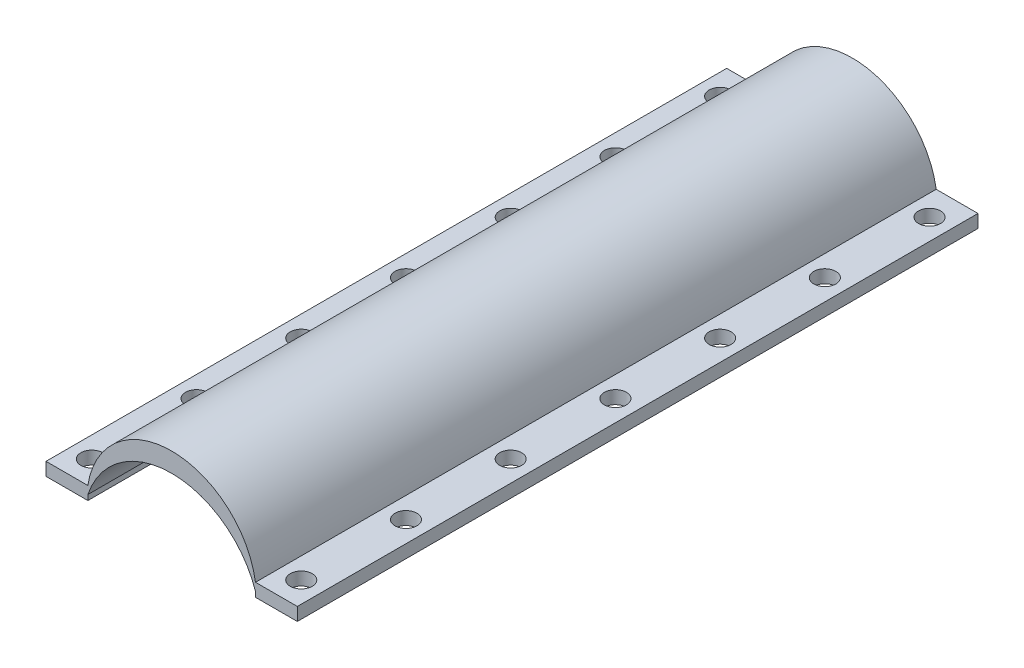
ISO-10303-21;
HEADER;
FILE_DESCRIPTION(('STEP AP214'),'2;1');
FILE_NAME('part.step','',(''),(''),'','','');
FILE_SCHEMA(('AUTOMOTIVE_DESIGN { 1 0 10303 214 1 1 1 1 }'));
ENDSEC;
DATA;
#1=APPLICATION_CONTEXT('core data for automotive mechanical design processes');
#2=APPLICATION_PROTOCOL_DEFINITION('international standard','automotive_design',2000,#1);
#3=PRODUCT_CONTEXT('',#1,'mechanical');
#4=PRODUCT('Part','Part','',(#3));
#5=PRODUCT_RELATED_PRODUCT_CATEGORY('part','',(#4));
#6=PRODUCT_DEFINITION_FORMATION('','',#4);
#7=PRODUCT_DEFINITION_CONTEXT('part definition',#1,'design');
#8=PRODUCT_DEFINITION('design','',#6,#7);
#9=PRODUCT_DEFINITION_SHAPE('','',#8);
#10=(LENGTH_UNIT() NAMED_UNIT(*) SI_UNIT(.MILLI.,.METRE.));
#11=(NAMED_UNIT(*) PLANE_ANGLE_UNIT() SI_UNIT($,.RADIAN.));
#12=(NAMED_UNIT(*) SI_UNIT($,.STERADIAN.) SOLID_ANGLE_UNIT());
#13=UNCERTAINTY_MEASURE_WITH_UNIT(LENGTH_MEASURE(1.E-05),#10,'distance_accuracy_value','');
#14=(GEOMETRIC_REPRESENTATION_CONTEXT(3) GLOBAL_UNCERTAINTY_ASSIGNED_CONTEXT((#13)) GLOBAL_UNIT_ASSIGNED_CONTEXT((#10,
#11,#12)) REPRESENTATION_CONTEXT('',''));
#15=CARTESIAN_POINT('',(0.,0.,0.));
#16=DIRECTION('',(0.,0.,1.));
#17=DIRECTION('',(1.,0.,0.));
#18=AXIS2_PLACEMENT_3D('',#15,#16,#17);
#19=CARTESIAN_POINT('',(25.4,0.,165.1));
#20=DIRECTION('',(0.,0.,-1.));
#21=DIRECTION('',(-1.,0.,0.));
#22=AXIS2_PLACEMENT_3D('',#19,#20,#21);
#23=CYLINDRICAL_SURFACE('',#22,20.580602670363);
#24=CARTESIAN_POINT('',(25.4,0.,0.));
#25=DIRECTION('',(0.,0.,1.));
#26=DIRECTION('',(-1.,0.,0.));
#27=AXIS2_PLACEMENT_3D('',#24,#25,#26);
#28=CIRCLE('',#27,20.580602670363);
#29=CARTESIAN_POINT('',(45.7363016753769,3.16165153731608,0.));
#30=VERTEX_POINT('',#29);
#31=CARTESIAN_POINT('',(5.06369832462309,3.16165153731608,0.));
#32=VERTEX_POINT('',#31);
#33=EDGE_CURVE('E160',#30,#32,#28,.T.);
#34=ORIENTED_EDGE('',*,*,#33,.T.);
#35=DIRECTION('',(0.,0.,-1.));
#36=VECTOR('',#35,1.);
#37=CARTESIAN_POINT('',(5.06369832462309,3.16165153731608,165.1));
#38=LINE('',#37,#36);
#39=CARTESIAN_POINT('',(5.06369832462309,3.16165153731608,165.1));
#40=VERTEX_POINT('',#39);
#41=EDGE_CURVE('E11',#40,#32,#38,.T.);
#42=ORIENTED_EDGE('',*,*,#41,.F.);
#43=CARTESIAN_POINT('',(25.4,0.,165.1));
#44=DIRECTION('',(0.,0.,1.));
#45=DIRECTION('',(-1.,0.,0.));
#46=AXIS2_PLACEMENT_3D('',#43,#44,#45);
#47=CIRCLE('',#46,20.580602670363);
#48=CARTESIAN_POINT('',(45.7363016753769,3.16165153731608,165.1));
#49=VERTEX_POINT('',#48);
#50=EDGE_CURVE('E188',#49,#40,#47,.T.);
#51=ORIENTED_EDGE('',*,*,#50,.F.);
#52=DIRECTION('',(0.,0.,-1.));
#53=VECTOR('',#52,1.);
#54=CARTESIAN_POINT('',(45.7363016753769,3.16165153731608,165.1));
#55=LINE('',#54,#53);
#56=EDGE_CURVE('E156',#49,#30,#55,.T.);
#57=ORIENTED_EDGE('',*,*,#56,.T.);
#58=EDGE_LOOP('',(#34,#42,#51,#57));
#59=FACE_BOUND('',#58,.T.);
#60=ADVANCED_FACE('F45',(#59),#23,.T.);
#61=CARTESIAN_POINT('',(-5.08,3.16165153731608,165.1));
#62=DIRECTION('',(0.,-1.,0.));
#63=DIRECTION('',(0.,0.,-1.));
#64=AXIS2_PLACEMENT_3D('',#61,#62,#63);
#65=PLANE('',#64);
#66=CARTESIAN_POINT('',(0.,3.16165153731608,32.0675));
#67=DIRECTION('',(0.,1.,0.));
#68=DIRECTION('',(0.,0.,1.));
#69=AXIS2_PLACEMENT_3D('',#66,#67,#68);
#70=CIRCLE('',#69,2.667);
#71=CARTESIAN_POINT('',(0.,3.16165153731608,34.7345));
#72=VERTEX_POINT('',#71);
#73=EDGE_CURVE('E390',#72,#72,#70,.T.);
#74=ORIENTED_EDGE('',*,*,#73,.F.);
#75=EDGE_LOOP('',(#74));
#76=FACE_BOUND('',#75,.T.);
#77=CARTESIAN_POINT('',(0.,3.16165153731608,57.4675));
#78=DIRECTION('',(0.,1.,0.));
#79=DIRECTION('',(0.,0.,1.));
#80=AXIS2_PLACEMENT_3D('',#77,#78,#79);
#81=CIRCLE('',#80,2.667);
#82=CARTESIAN_POINT('',(0.,3.16165153731608,60.1345));
#83=VERTEX_POINT('',#82);
#84=EDGE_CURVE('E384',#83,#83,#81,.T.);
#85=ORIENTED_EDGE('',*,*,#84,.F.);
#86=EDGE_LOOP('',(#85));
#87=FACE_BOUND('',#86,.T.);
#88=CARTESIAN_POINT('',(0.,3.16165153731608,82.8675));
#89=DIRECTION('',(0.,1.,0.));
#90=DIRECTION('',(0.,0.,1.));
#91=AXIS2_PLACEMENT_3D('',#88,#89,#90);
#92=CIRCLE('',#91,2.667);
#93=CARTESIAN_POINT('',(0.,3.16165153731608,85.5345));
#94=VERTEX_POINT('',#93);
#95=EDGE_CURVE('E367',#94,#94,#92,.T.);
#96=ORIENTED_EDGE('',*,*,#95,.F.);
#97=EDGE_LOOP('',(#96));
#98=FACE_BOUND('',#97,.T.);
#99=CARTESIAN_POINT('',(0.,3.16165153731608,108.2675));
#100=DIRECTION('',(0.,1.,0.));
#101=DIRECTION('',(0.,0.,1.));
#102=AXIS2_PLACEMENT_3D('',#99,#100,#101);
#103=CIRCLE('',#102,2.667);
#104=CARTESIAN_POINT('',(0.,3.16165153731608,110.9345));
#105=VERTEX_POINT('',#104);
#106=EDGE_CURVE('E385',#105,#105,#103,.T.);
#107=ORIENTED_EDGE('',*,*,#106,.F.);
#108=EDGE_LOOP('',(#107));
#109=FACE_BOUND('',#108,.T.);
#110=CARTESIAN_POINT('',(0.,3.16165153731608,133.6675));
#111=DIRECTION('',(0.,1.,0.));
#112=DIRECTION('',(0.,0.,1.));
#113=AXIS2_PLACEMENT_3D('',#110,#111,#112);
#114=CIRCLE('',#113,2.667);
#115=CARTESIAN_POINT('',(0.,3.16165153731608,136.3345));
#116=VERTEX_POINT('',#115);
#117=EDGE_CURVE('E393',#116,#116,#114,.T.);
#118=ORIENTED_EDGE('',*,*,#117,.F.);
#119=EDGE_LOOP('',(#118));
#120=FACE_BOUND('',#119,.T.);
#121=CARTESIAN_POINT('',(0.,3.16165153731608,159.0675));
#122=DIRECTION('',(0.,1.,0.));
#123=DIRECTION('',(0.,0.,1.));
#124=AXIS2_PLACEMENT_3D('',#121,#122,#123);
#125=CIRCLE('',#124,2.667);
#126=CARTESIAN_POINT('',(0.,3.16165153731608,161.7345));
#127=VERTEX_POINT('',#126);
#128=EDGE_CURVE('E400',#127,#127,#125,.T.);
#129=ORIENTED_EDGE('',*,*,#128,.F.);
#130=EDGE_LOOP('',(#129));
#131=FACE_BOUND('',#130,.T.);
#132=CARTESIAN_POINT('',(0.,3.16165153731608,6.6675));
#133=DIRECTION('',(0.,1.,0.));
#134=DIRECTION('',(0.,0.,1.));
#135=AXIS2_PLACEMENT_3D('',#132,#133,#134);
#136=CIRCLE('',#135,2.667);
#137=CARTESIAN_POINT('',(0.,3.16165153731608,9.3345));
#138=VERTEX_POINT('',#137);
#139=EDGE_CURVE('E413',#138,#138,#136,.T.);
#140=ORIENTED_EDGE('',*,*,#139,.F.);
#141=EDGE_LOOP('',(#140));
#142=FACE_BOUND('',#141,.T.);
#143=DIRECTION('',(-1.,0.,0.));
#144=VECTOR('',#143,1.);
#145=CARTESIAN_POINT('',(-5.08,3.16165153731608,0.));
#146=LINE('',#145,#144);
#147=CARTESIAN_POINT('',(-5.08,3.16165153731608,0.));
#148=VERTEX_POINT('',#147);
#149=EDGE_CURVE('E164',#32,#148,#146,.T.);
#150=ORIENTED_EDGE('',*,*,#149,.T.);
#151=DIRECTION('',(0.,0.,-1.));
#152=VECTOR('',#151,1.);
#153=CARTESIAN_POINT('',(-5.08,3.16165153731608,165.1));
#154=LINE('',#153,#152);
#155=CARTESIAN_POINT('',(-5.08,3.16165153731608,165.1));
#156=VERTEX_POINT('',#155);
#157=EDGE_CURVE('E55',#156,#148,#154,.T.);
#158=ORIENTED_EDGE('',*,*,#157,.F.);
#159=DIRECTION('',(-1.,0.,0.));
#160=VECTOR('',#159,1.);
#161=CARTESIAN_POINT('',(-5.08,3.16165153731608,165.1));
#162=LINE('',#161,#160);
#163=EDGE_CURVE('E113',#40,#156,#162,.T.);
#164=ORIENTED_EDGE('',*,*,#163,.F.);
#165=ORIENTED_EDGE('',*,*,#41,.T.);
#166=EDGE_LOOP('',(#150,#158,#164,#165));
#167=FACE_BOUND('',#166,.T.);
#168=ADVANCED_FACE('F259',(#76,#87,#98,#109,#120,#131,#142,#167),#65,.F.);
#169=CARTESIAN_POINT('',(-5.08,0.,165.1));
#170=DIRECTION('',(1.,0.,0.));
#171=DIRECTION('',(0.,0.,-1.));
#172=AXIS2_PLACEMENT_3D('',#169,#170,#171);
#173=PLANE('',#172);
#174=DIRECTION('',(0.,-1.,0.));
#175=VECTOR('',#174,1.);
#176=CARTESIAN_POINT('',(-5.08,0.,0.));
#177=LINE('',#176,#175);
#178=CARTESIAN_POINT('',(-5.08,0.,0.));
#179=VERTEX_POINT('',#178);
#180=EDGE_CURVE('E167',#148,#179,#177,.T.);
#181=ORIENTED_EDGE('',*,*,#180,.T.);
#182=DIRECTION('',(0.,0.,-1.));
#183=VECTOR('',#182,1.);
#184=CARTESIAN_POINT('',(-5.08,0.,165.1));
#185=LINE('',#184,#183);
#186=CARTESIAN_POINT('',(-5.08,0.,165.1));
#187=VERTEX_POINT('',#186);
#188=EDGE_CURVE('E207',#187,#179,#185,.T.);
#189=ORIENTED_EDGE('',*,*,#188,.F.);
#190=DIRECTION('',(0.,-1.,0.));
#191=VECTOR('',#190,1.);
#192=CARTESIAN_POINT('',(-5.08,0.,165.1));
#193=LINE('',#192,#191);
#194=EDGE_CURVE('E277',#156,#187,#193,.T.);
#195=ORIENTED_EDGE('',*,*,#194,.F.);
#196=ORIENTED_EDGE('',*,*,#157,.T.);
#197=EDGE_LOOP('',(#181,#189,#195,#196));
#198=FACE_BOUND('',#197,.T.);
#199=ADVANCED_FACE('F265',(#198),#173,.F.);
#200=CARTESIAN_POINT('',(-5.08,0.,165.1));
#201=DIRECTION('',(0.,1.,0.));
#202=DIRECTION('',(-1.,0.,0.));
#203=AXIS2_PLACEMENT_3D('',#200,#201,#202);
#204=PLANE('',#203);
#205=CARTESIAN_POINT('',(0.,0.,32.0675));
#206=DIRECTION('',(0.,1.,0.));
#207=DIRECTION('',(-1.,0.,0.));
#208=AXIS2_PLACEMENT_3D('',#205,#206,#207);
#209=CIRCLE('',#208,2.667);
#210=CARTESIAN_POINT('',(-2.667,0.,32.0675));
#211=VERTEX_POINT('',#210);
#212=EDGE_CURVE('E48',#211,#211,#209,.T.);
#213=ORIENTED_EDGE('',*,*,#212,.T.);
#214=EDGE_LOOP('',(#213));
#215=FACE_BOUND('',#214,.T.);
#216=CARTESIAN_POINT('',(0.,0.,57.4675));
#217=DIRECTION('',(0.,1.,0.));
#218=DIRECTION('',(-1.,0.,0.));
#219=AXIS2_PLACEMENT_3D('',#216,#217,#218);
#220=CIRCLE('',#219,2.667);
#221=CARTESIAN_POINT('',(-2.667,0.,57.4675));
#222=VERTEX_POINT('',#221);
#223=EDGE_CURVE('E234',#222,#222,#220,.T.);
#224=ORIENTED_EDGE('',*,*,#223,.T.);
#225=EDGE_LOOP('',(#224));
#226=FACE_BOUND('',#225,.T.);
#227=CARTESIAN_POINT('',(0.,0.,82.8675));
#228=DIRECTION('',(0.,1.,0.));
#229=DIRECTION('',(-1.,0.,0.));
#230=AXIS2_PLACEMENT_3D('',#227,#228,#229);
#231=CIRCLE('',#230,2.667);
#232=CARTESIAN_POINT('',(-2.66699999999999,0.,82.8675));
#233=VERTEX_POINT('',#232);
#234=EDGE_CURVE('E231',#233,#233,#231,.T.);
#235=ORIENTED_EDGE('',*,*,#234,.T.);
#236=EDGE_LOOP('',(#235));
#237=FACE_BOUND('',#236,.T.);
#238=CARTESIAN_POINT('',(0.,0.,108.2675));
#239=DIRECTION('',(0.,1.,0.));
#240=DIRECTION('',(-1.,0.,0.));
#241=AXIS2_PLACEMENT_3D('',#238,#239,#240);
#242=CIRCLE('',#241,2.667);
#243=CARTESIAN_POINT('',(-2.66699999999999,0.,108.2675));
#244=VERTEX_POINT('',#243);
#245=EDGE_CURVE('E227',#244,#244,#242,.T.);
#246=ORIENTED_EDGE('',*,*,#245,.T.);
#247=EDGE_LOOP('',(#246));
#248=FACE_BOUND('',#247,.T.);
#249=CARTESIAN_POINT('',(0.,0.,133.6675));
#250=DIRECTION('',(0.,1.,0.));
#251=DIRECTION('',(-1.,0.,0.));
#252=AXIS2_PLACEMENT_3D('',#249,#250,#251);
#253=CIRCLE('',#252,2.667);
#254=CARTESIAN_POINT('',(-2.667,0.,133.6675));
#255=VERTEX_POINT('',#254);
#256=EDGE_CURVE('E223',#255,#255,#253,.T.);
#257=ORIENTED_EDGE('',*,*,#256,.T.);
#258=EDGE_LOOP('',(#257));
#259=FACE_BOUND('',#258,.T.);
#260=CARTESIAN_POINT('',(0.,0.,159.0675));
#261=DIRECTION('',(0.,1.,0.));
#262=DIRECTION('',(-1.,0.,0.));
#263=AXIS2_PLACEMENT_3D('',#260,#261,#262);
#264=CIRCLE('',#263,2.667);
#265=CARTESIAN_POINT('',(-2.667,0.,159.0675));
#266=VERTEX_POINT('',#265);
#267=EDGE_CURVE('E218',#266,#266,#264,.T.);
#268=ORIENTED_EDGE('',*,*,#267,.T.);
#269=EDGE_LOOP('',(#268));
#270=FACE_BOUND('',#269,.T.);
#271=CARTESIAN_POINT('',(0.,0.,6.6675));
#272=DIRECTION('',(0.,1.,0.));
#273=DIRECTION('',(-1.,0.,0.));
#274=AXIS2_PLACEMENT_3D('',#271,#272,#273);
#275=CIRCLE('',#274,2.667);
#276=CARTESIAN_POINT('',(-2.667,0.,6.6675));
#277=VERTEX_POINT('',#276);
#278=EDGE_CURVE('E214',#277,#277,#275,.T.);
#279=ORIENTED_EDGE('',*,*,#278,.T.);
#280=EDGE_LOOP('',(#279));
#281=FACE_BOUND('',#280,.T.);
#282=DIRECTION('',(1.,0.,0.));
#283=VECTOR('',#282,1.);
#284=CARTESIAN_POINT('',(-5.08,0.,0.));
#285=LINE('',#284,#283);
#286=CARTESIAN_POINT('',(5.08,0.,0.));
#287=VERTEX_POINT('',#286);
#288=EDGE_CURVE('E170',#179,#287,#285,.T.);
#289=ORIENTED_EDGE('',*,*,#288,.T.);
#290=DIRECTION('',(0.,0.,-1.));
#291=VECTOR('',#290,1.);
#292=CARTESIAN_POINT('',(5.08,0.,165.1));
#293=LINE('',#292,#291);
#294=CARTESIAN_POINT('',(5.08,0.,165.1));
#295=VERTEX_POINT('',#294);
#296=EDGE_CURVE('E203',#295,#287,#293,.T.);
#297=ORIENTED_EDGE('',*,*,#296,.F.);
#298=DIRECTION('',(1.,0.,0.));
#299=VECTOR('',#298,1.);
#300=CARTESIAN_POINT('',(-5.08,0.,165.1));
#301=LINE('',#300,#299);
#302=EDGE_CURVE('E280',#187,#295,#301,.T.);
#303=ORIENTED_EDGE('',*,*,#302,.F.);
#304=ORIENTED_EDGE('',*,*,#188,.T.);
#305=EDGE_LOOP('',(#289,#297,#303,#304));
#306=FACE_BOUND('',#305,.T.);
#307=ADVANCED_FACE('F243',(#215,#226,#237,#248,#259,#270,#281,#306),#204,.F.);
#308=CARTESIAN_POINT('',(5.08,0.,165.1));
#309=DIRECTION('',(-1.,0.,0.));
#310=DIRECTION('',(0.,0.,1.));
#311=AXIS2_PLACEMENT_3D('',#308,#309,#310);
#312=PLANE('',#311);
#313=DIRECTION('',(0.,1.,0.));
#314=VECTOR('',#313,1.);
#315=CARTESIAN_POINT('',(5.08,0.,0.));
#316=LINE('',#315,#314);
#317=CARTESIAN_POINT('',(5.08,1.27,0.));
#318=VERTEX_POINT('',#317);
#319=EDGE_CURVE('E173',#287,#318,#316,.T.);
#320=ORIENTED_EDGE('',*,*,#319,.T.);
#321=DIRECTION('',(0.,0.,-1.));
#322=VECTOR('',#321,1.);
#323=CARTESIAN_POINT('',(5.08,1.27,165.1));
#324=LINE('',#323,#322);
#325=CARTESIAN_POINT('',(5.08,1.27,165.1));
#326=VERTEX_POINT('',#325);
#327=EDGE_CURVE('E199',#326,#318,#324,.T.);
#328=ORIENTED_EDGE('',*,*,#327,.F.);
#329=DIRECTION('',(0.,1.,0.));
#330=VECTOR('',#329,1.);
#331=CARTESIAN_POINT('',(5.08,0.,165.1));
#332=LINE('',#331,#330);
#333=EDGE_CURVE('E284',#295,#326,#332,.T.);
#334=ORIENTED_EDGE('',*,*,#333,.F.);
#335=ORIENTED_EDGE('',*,*,#296,.T.);
#336=EDGE_LOOP('',(#320,#328,#334,#335));
#337=FACE_BOUND('',#336,.T.);
#338=ADVANCED_FACE('F306',(#337),#312,.F.);
#339=CARTESIAN_POINT('',(25.4,-5.5331580411657,165.1));
#340=DIRECTION('',(0.,0.,-1.));
#341=DIRECTION('',(-1.,0.,0.));
#342=AXIS2_PLACEMENT_3D('',#339,#340,#341);
#343=CYLINDRICAL_SURFACE('',#342,21.4286107653548);
#344=CARTESIAN_POINT('',(25.4,-5.5331580411657,0.));
#345=DIRECTION('',(0.,0.,-1.));
#346=DIRECTION('',(-1.,0.,0.));
#347=AXIS2_PLACEMENT_3D('',#344,#345,#346);
#348=CIRCLE('',#347,21.4286107653548);
#349=CARTESIAN_POINT('',(45.72,1.27,0.));
#350=VERTEX_POINT('',#349);
#351=EDGE_CURVE('E176',#318,#350,#348,.T.);
#352=ORIENTED_EDGE('',*,*,#351,.T.);
#353=DIRECTION('',(0.,0.,-1.));
#354=VECTOR('',#353,1.);
#355=CARTESIAN_POINT('',(45.72,1.27,165.1));
#356=LINE('',#355,#354);
#357=CARTESIAN_POINT('',(45.72,1.27,165.1));
#358=VERTEX_POINT('',#357);
#359=EDGE_CURVE('E195',#358,#350,#356,.T.);
#360=ORIENTED_EDGE('',*,*,#359,.F.);
#361=CARTESIAN_POINT('',(25.4,-5.5331580411657,165.1));
#362=DIRECTION('',(0.,0.,-1.));
#363=DIRECTION('',(-1.,0.,0.));
#364=AXIS2_PLACEMENT_3D('',#361,#362,#363);
#365=CIRCLE('',#364,21.4286107653548);
#366=EDGE_CURVE('E291',#326,#358,#365,.T.);
#367=ORIENTED_EDGE('',*,*,#366,.F.);
#368=ORIENTED_EDGE('',*,*,#327,.T.);
#369=EDGE_LOOP('',(#352,#360,#367,#368));
#370=FACE_BOUND('',#369,.T.);
#371=ADVANCED_FACE('F299',(#370),#343,.F.);
#372=CARTESIAN_POINT('',(45.72,0.,165.1));
#373=DIRECTION('',(1.,0.,0.));
#374=DIRECTION('',(0.,0.,-1.));
#375=AXIS2_PLACEMENT_3D('',#372,#373,#374);
#376=PLANE('',#375);
#377=DIRECTION('',(0.,-1.,0.));
#378=VECTOR('',#377,1.);
#379=CARTESIAN_POINT('',(45.72,0.,0.));
#380=LINE('',#379,#378);
#381=CARTESIAN_POINT('',(45.72,0.,0.));
#382=VERTEX_POINT('',#381);
#383=EDGE_CURVE('E179',#350,#382,#380,.T.);
#384=ORIENTED_EDGE('',*,*,#383,.T.);
#385=DIRECTION('',(0.,0.,-1.));
#386=VECTOR('',#385,1.);
#387=CARTESIAN_POINT('',(45.72,0.,165.1));
#388=LINE('',#387,#386);
#389=CARTESIAN_POINT('',(45.72,0.,165.1));
#390=VERTEX_POINT('',#389);
#391=EDGE_CURVE('E149',#390,#382,#388,.T.);
#392=ORIENTED_EDGE('',*,*,#391,.F.);
#393=DIRECTION('',(0.,-1.,0.));
#394=VECTOR('',#393,1.);
#395=CARTESIAN_POINT('',(45.72,0.,165.1));
#396=LINE('',#395,#394);
#397=EDGE_CURVE('E138',#358,#390,#396,.T.);
#398=ORIENTED_EDGE('',*,*,#397,.F.);
#399=ORIENTED_EDGE('',*,*,#359,.T.);
#400=EDGE_LOOP('',(#384,#392,#398,#399));
#401=FACE_BOUND('',#400,.T.);
#402=ADVANCED_FACE('F303',(#401),#376,.F.);
#403=CARTESIAN_POINT('',(45.72,0.,165.1));
#404=DIRECTION('',(0.,1.,0.));
#405=DIRECTION('',(-1.,0.,0.));
#406=AXIS2_PLACEMENT_3D('',#403,#404,#405);
#407=PLANE('',#406);
#408=CARTESIAN_POINT('',(50.8,0.,159.0675));
#409=DIRECTION('',(0.,1.,0.));
#410=DIRECTION('',(-1.,0.,0.));
#411=AXIS2_PLACEMENT_3D('',#408,#409,#410);
#412=CIRCLE('',#411,2.667);
#413=CARTESIAN_POINT('',(48.133,0.,159.0675));
#414=VERTEX_POINT('',#413);
#415=EDGE_CURVE('E219',#414,#414,#412,.T.);
#416=ORIENTED_EDGE('',*,*,#415,.T.);
#417=EDGE_LOOP('',(#416));
#418=FACE_BOUND('',#417,.T.);
#419=CARTESIAN_POINT('',(50.8,0.,133.6675));
#420=DIRECTION('',(0.,1.,0.));
#421=DIRECTION('',(-1.,0.,0.));
#422=AXIS2_PLACEMENT_3D('',#419,#420,#421);
#423=CIRCLE('',#422,2.667);
#424=CARTESIAN_POINT('',(48.133,0.,133.6675));
#425=VERTEX_POINT('',#424);
#426=EDGE_CURVE('E437',#425,#425,#423,.T.);
#427=ORIENTED_EDGE('',*,*,#426,.T.);
#428=EDGE_LOOP('',(#427));
#429=FACE_BOUND('',#428,.T.);
#430=CARTESIAN_POINT('',(50.8,0.,108.2675));
#431=DIRECTION('',(0.,1.,0.));
#432=DIRECTION('',(-1.,0.,0.));
#433=AXIS2_PLACEMENT_3D('',#430,#431,#432);
#434=CIRCLE('',#433,2.66699999999999);
#435=CARTESIAN_POINT('',(48.133,0.,108.2675));
#436=VERTEX_POINT('',#435);
#437=EDGE_CURVE('E433',#436,#436,#434,.T.);
#438=ORIENTED_EDGE('',*,*,#437,.T.);
#439=EDGE_LOOP('',(#438));
#440=FACE_BOUND('',#439,.T.);
#441=CARTESIAN_POINT('',(50.8,0.,82.8675));
#442=DIRECTION('',(0.,1.,0.));
#443=DIRECTION('',(-1.,0.,0.));
#444=AXIS2_PLACEMENT_3D('',#441,#442,#443);
#445=CIRCLE('',#444,2.66699999999999);
#446=CARTESIAN_POINT('',(48.133,0.,82.8675));
#447=VERTEX_POINT('',#446);
#448=EDGE_CURVE('E429',#447,#447,#445,.T.);
#449=ORIENTED_EDGE('',*,*,#448,.T.);
#450=EDGE_LOOP('',(#449));
#451=FACE_BOUND('',#450,.T.);
#452=CARTESIAN_POINT('',(50.8,0.,57.4675));
#453=DIRECTION('',(0.,1.,0.));
#454=DIRECTION('',(-1.,0.,0.));
#455=AXIS2_PLACEMENT_3D('',#452,#453,#454);
#456=CIRCLE('',#455,2.667);
#457=CARTESIAN_POINT('',(48.133,0.,57.4675));
#458=VERTEX_POINT('',#457);
#459=EDGE_CURVE('E425',#458,#458,#456,.T.);
#460=ORIENTED_EDGE('',*,*,#459,.T.);
#461=EDGE_LOOP('',(#460));
#462=FACE_BOUND('',#461,.T.);
#463=CARTESIAN_POINT('',(50.8,0.,32.0675));
#464=DIRECTION('',(0.,1.,0.));
#465=DIRECTION('',(-1.,0.,0.));
#466=AXIS2_PLACEMENT_3D('',#463,#464,#465);
#467=CIRCLE('',#466,2.667);
#468=CARTESIAN_POINT('',(48.133,0.,32.0675));
#469=VERTEX_POINT('',#468);
#470=EDGE_CURVE('E421',#469,#469,#467,.T.);
#471=ORIENTED_EDGE('',*,*,#470,.T.);
#472=EDGE_LOOP('',(#471));
#473=FACE_BOUND('',#472,.T.);
#474=CARTESIAN_POINT('',(50.8,0.,6.66749999999999));
#475=DIRECTION('',(0.,1.,0.));
#476=DIRECTION('',(-1.,0.,0.));
#477=AXIS2_PLACEMENT_3D('',#474,#475,#476);
#478=CIRCLE('',#477,2.667);
#479=CARTESIAN_POINT('',(48.133,0.,6.66749999999999));
#480=VERTEX_POINT('',#479);
#481=EDGE_CURVE('E417',#480,#480,#478,.T.);
#482=ORIENTED_EDGE('',*,*,#481,.T.);
#483=EDGE_LOOP('',(#482));
#484=FACE_BOUND('',#483,.T.);
#485=DIRECTION('',(1.,0.,0.));
#486=VECTOR('',#485,1.);
#487=CARTESIAN_POINT('',(45.72,0.,0.));
#488=LINE('',#487,#486);
#489=CARTESIAN_POINT('',(55.88,0.,0.));
#490=VERTEX_POINT('',#489);
#491=EDGE_CURVE('E147',#382,#490,#488,.T.);
#492=ORIENTED_EDGE('',*,*,#491,.T.);
#493=DIRECTION('',(0.,0.,-1.));
#494=VECTOR('',#493,1.);
#495=CARTESIAN_POINT('',(55.88,0.,165.1));
#496=LINE('',#495,#494);
#497=CARTESIAN_POINT('',(55.88,0.,165.1));
#498=VERTEX_POINT('',#497);
#499=EDGE_CURVE('E144',#498,#490,#496,.T.);
#500=ORIENTED_EDGE('',*,*,#499,.F.);
#501=DIRECTION('',(1.,0.,0.));
#502=VECTOR('',#501,1.);
#503=CARTESIAN_POINT('',(45.72,0.,165.1));
#504=LINE('',#503,#502);
#505=EDGE_CURVE('E132',#390,#498,#504,.T.);
#506=ORIENTED_EDGE('',*,*,#505,.F.);
#507=ORIENTED_EDGE('',*,*,#391,.T.);
#508=EDGE_LOOP('',(#492,#500,#506,#507));
#509=FACE_BOUND('',#508,.T.);
#510=ADVANCED_FACE('F145',(#418,#429,#440,#451,#462,#473,#484,#509),#407,.F.);
#511=CARTESIAN_POINT('',(55.88,0.,165.1));
#512=DIRECTION('',(-1.,0.,0.));
#513=DIRECTION('',(0.,0.,1.));
#514=AXIS2_PLACEMENT_3D('',#511,#512,#513);
#515=PLANE('',#514);
#516=DIRECTION('',(0.,1.,0.));
#517=VECTOR('',#516,1.);
#518=CARTESIAN_POINT('',(55.88,0.,0.));
#519=LINE('',#518,#517);
#520=CARTESIAN_POINT('',(55.88,3.16165153731608,0.));
#521=VERTEX_POINT('',#520);
#522=EDGE_CURVE('E99',#490,#521,#519,.T.);
#523=ORIENTED_EDGE('',*,*,#522,.T.);
#524=DIRECTION('',(0.,0.,-1.));
#525=VECTOR('',#524,1.);
#526=CARTESIAN_POINT('',(55.88,3.16165153731608,165.1));
#527=LINE('',#526,#525);
#528=CARTESIAN_POINT('',(55.88,3.16165153731608,165.1));
#529=VERTEX_POINT('',#528);
#530=EDGE_CURVE('E150',#529,#521,#527,.T.);
#531=ORIENTED_EDGE('',*,*,#530,.F.);
#532=DIRECTION('',(0.,1.,0.));
#533=VECTOR('',#532,1.);
#534=CARTESIAN_POINT('',(55.88,0.,165.1));
#535=LINE('',#534,#533);
#536=EDGE_CURVE('E136',#498,#529,#535,.T.);
#537=ORIENTED_EDGE('',*,*,#536,.F.);
#538=ORIENTED_EDGE('',*,*,#499,.T.);
#539=EDGE_LOOP('',(#523,#531,#537,#538));
#540=FACE_BOUND('',#539,.T.);
#541=ADVANCED_FACE('F152',(#540),#515,.F.);
#542=CARTESIAN_POINT('',(55.88,3.16165153731608,165.1));
#543=DIRECTION('',(0.,-1.,0.));
#544=DIRECTION('',(1.,0.,0.));
#545=AXIS2_PLACEMENT_3D('',#542,#543,#544);
#546=PLANE('',#545);
#547=CARTESIAN_POINT('',(50.8,3.16165153731608,159.0675));
#548=DIRECTION('',(0.,1.,0.));
#549=DIRECTION('',(0.,0.,-1.));
#550=AXIS2_PLACEMENT_3D('',#547,#548,#549);
#551=CIRCLE('',#550,2.667);
#552=CARTESIAN_POINT('',(50.8,3.16165153731608,156.4005));
#553=VERTEX_POINT('',#552);
#554=EDGE_CURVE('E404',#553,#553,#551,.T.);
#555=ORIENTED_EDGE('',*,*,#554,.F.);
#556=EDGE_LOOP('',(#555));
#557=FACE_BOUND('',#556,.T.);
#558=CARTESIAN_POINT('',(50.8,3.16165153731608,133.6675));
#559=DIRECTION('',(0.,1.,0.));
#560=DIRECTION('',(0.,0.,-1.));
#561=AXIS2_PLACEMENT_3D('',#558,#559,#560);
#562=CIRCLE('',#561,2.667);
#563=CARTESIAN_POINT('',(50.8,3.16165153731608,131.0005));
#564=VERTEX_POINT('',#563);
#565=EDGE_CURVE('E408',#564,#564,#562,.T.);
#566=ORIENTED_EDGE('',*,*,#565,.F.);
#567=EDGE_LOOP('',(#566));
#568=FACE_BOUND('',#567,.T.);
#569=CARTESIAN_POINT('',(50.8,3.16165153731608,108.2675));
#570=DIRECTION('',(0.,1.,0.));
#571=DIRECTION('',(0.,0.,-1.));
#572=AXIS2_PLACEMENT_3D('',#569,#570,#571);
#573=CIRCLE('',#572,2.66699999999999);
#574=CARTESIAN_POINT('',(50.8,3.16165153731608,105.6005));
#575=VERTEX_POINT('',#574);
#576=EDGE_CURVE('E412',#575,#575,#573,.T.);
#577=ORIENTED_EDGE('',*,*,#576,.F.);
#578=EDGE_LOOP('',(#577));
#579=FACE_BOUND('',#578,.T.);
#580=CARTESIAN_POINT('',(50.8,3.16165153731608,82.8675));
#581=DIRECTION('',(0.,1.,0.));
#582=DIRECTION('',(0.,0.,-1.));
#583=AXIS2_PLACEMENT_3D('',#580,#581,#582);
#584=CIRCLE('',#583,2.66699999999999);
#585=CARTESIAN_POINT('',(50.8,3.16165153731608,80.2005));
#586=VERTEX_POINT('',#585);
#587=EDGE_CURVE('E486',#586,#586,#584,.T.);
#588=ORIENTED_EDGE('',*,*,#587,.F.);
#589=EDGE_LOOP('',(#588));
#590=FACE_BOUND('',#589,.T.);
#591=CARTESIAN_POINT('',(50.8,3.16165153731608,57.4675));
#592=DIRECTION('',(0.,1.,0.));
#593=DIRECTION('',(0.,0.,-1.));
#594=AXIS2_PLACEMENT_3D('',#591,#592,#593);
#595=CIRCLE('',#594,2.667);
#596=CARTESIAN_POINT('',(50.8,3.16165153731608,54.8005));
#597=VERTEX_POINT('',#596);
#598=EDGE_CURVE('E490',#597,#597,#595,.T.);
#599=ORIENTED_EDGE('',*,*,#598,.F.);
#600=EDGE_LOOP('',(#599));
#601=FACE_BOUND('',#600,.T.);
#602=CARTESIAN_POINT('',(50.8,3.16165153731608,32.0675));
#603=DIRECTION('',(0.,1.,0.));
#604=DIRECTION('',(0.,0.,-1.));
#605=AXIS2_PLACEMENT_3D('',#602,#603,#604);
#606=CIRCLE('',#605,2.667);
#607=CARTESIAN_POINT('',(50.8,3.16165153731608,29.4005));
#608=VERTEX_POINT('',#607);
#609=EDGE_CURVE('E496',#608,#608,#606,.T.);
#610=ORIENTED_EDGE('',*,*,#609,.F.);
#611=EDGE_LOOP('',(#610));
#612=FACE_BOUND('',#611,.T.);
#613=CARTESIAN_POINT('',(50.8,3.16165153731608,6.66749999999999));
#614=DIRECTION('',(0.,1.,0.));
#615=DIRECTION('',(0.,0.,-1.));
#616=AXIS2_PLACEMENT_3D('',#613,#614,#615);
#617=CIRCLE('',#616,2.667);
#618=CARTESIAN_POINT('',(50.8,3.16165153731608,4.0005));
#619=VERTEX_POINT('',#618);
#620=EDGE_CURVE('E500',#619,#619,#617,.T.);
#621=ORIENTED_EDGE('',*,*,#620,.F.);
#622=EDGE_LOOP('',(#621));
#623=FACE_BOUND('',#622,.T.);
#624=DIRECTION('',(-1.,0.,0.));
#625=VECTOR('',#624,1.);
#626=CARTESIAN_POINT('',(55.88,3.16165153731608,0.));
#627=LINE('',#626,#625);
#628=EDGE_CURVE('E105',#521,#30,#627,.T.);
#629=ORIENTED_EDGE('',*,*,#628,.T.);
#630=ORIENTED_EDGE('',*,*,#56,.F.);
#631=DIRECTION('',(-1.,0.,0.));
#632=VECTOR('',#631,1.);
#633=CARTESIAN_POINT('',(55.88,3.16165153731608,165.1));
#634=LINE('',#633,#632);
#635=EDGE_CURVE('E64',#529,#49,#634,.T.);
#636=ORIENTED_EDGE('',*,*,#635,.F.);
#637=ORIENTED_EDGE('',*,*,#530,.T.);
#638=EDGE_LOOP('',(#629,#630,#636,#637));
#639=FACE_BOUND('',#638,.T.);
#640=ADVANCED_FACE('F326',(#557,#568,#579,#590,#601,#612,#623,#639),#546,.F.);
#641=CARTESIAN_POINT('',(25.4,0.,165.1));
#642=DIRECTION('',(0.,0.,-1.));
#643=DIRECTION('',(-1.,0.,0.));
#644=AXIS2_PLACEMENT_3D('',#641,#642,#643);
#645=PLANE('',#644);
#646=ORIENTED_EDGE('',*,*,#50,.T.);
#647=ORIENTED_EDGE('',*,*,#163,.T.);
#648=ORIENTED_EDGE('',*,*,#194,.T.);
#649=ORIENTED_EDGE('',*,*,#302,.T.);
#650=ORIENTED_EDGE('',*,*,#333,.T.);
#651=ORIENTED_EDGE('',*,*,#366,.T.);
#652=ORIENTED_EDGE('',*,*,#397,.T.);
#653=ORIENTED_EDGE('',*,*,#505,.T.);
#654=ORIENTED_EDGE('',*,*,#536,.T.);
#655=ORIENTED_EDGE('',*,*,#635,.T.);
#656=EDGE_LOOP('',(#646,#647,#648,#649,#650,#651,#652,#653,#654,#655));
#657=FACE_BOUND('',#656,.T.);
#658=ADVANCED_FACE('F134',(#657),#645,.F.);
#659=CARTESIAN_POINT('',(25.4,0.,0.));
#660=DIRECTION('',(0.,0.,-1.));
#661=DIRECTION('',(-1.,0.,0.));
#662=AXIS2_PLACEMENT_3D('',#659,#660,#661);
#663=PLANE('',#662);
#664=ORIENTED_EDGE('',*,*,#33,.F.);
#665=ORIENTED_EDGE('',*,*,#628,.F.);
#666=ORIENTED_EDGE('',*,*,#522,.F.);
#667=ORIENTED_EDGE('',*,*,#491,.F.);
#668=ORIENTED_EDGE('',*,*,#383,.F.);
#669=ORIENTED_EDGE('',*,*,#351,.F.);
#670=ORIENTED_EDGE('',*,*,#319,.F.);
#671=ORIENTED_EDGE('',*,*,#288,.F.);
#672=ORIENTED_EDGE('',*,*,#180,.F.);
#673=ORIENTED_EDGE('',*,*,#149,.F.);
#674=EDGE_LOOP('',(#664,#665,#666,#667,#668,#669,#670,#671,#672,#673));
#675=FACE_BOUND('',#674,.T.);
#676=ADVANCED_FACE('F271',(#675),#663,.T.);
#677=CARTESIAN_POINT('',(50.8,-161.938348462684,6.66749999999999));
#678=DIRECTION('',(0.,1.,0.));
#679=DIRECTION('',(0.,0.,1.));
#680=AXIS2_PLACEMENT_3D('',#677,#678,#679);
#681=CYLINDRICAL_SURFACE('',#680,2.667);
#682=ORIENTED_EDGE('',*,*,#620,.T.);
#683=EDGE_LOOP('',(#682));
#684=FACE_BOUND('',#683,.T.);
#685=ORIENTED_EDGE('',*,*,#481,.F.);
#686=EDGE_LOOP('',(#685));
#687=FACE_BOUND('',#686,.T.);
#688=ADVANCED_FACE('F332',(#684,#687),#681,.F.);
#689=CARTESIAN_POINT('',(50.8,-161.938348462684,32.0675));
#690=DIRECTION('',(0.,1.,0.));
#691=DIRECTION('',(0.,0.,1.));
#692=AXIS2_PLACEMENT_3D('',#689,#690,#691);
#693=CYLINDRICAL_SURFACE('',#692,2.667);
#694=ORIENTED_EDGE('',*,*,#609,.T.);
#695=EDGE_LOOP('',(#694));
#696=FACE_BOUND('',#695,.T.);
#697=ORIENTED_EDGE('',*,*,#470,.F.);
#698=EDGE_LOOP('',(#697));
#699=FACE_BOUND('',#698,.T.);
#700=ADVANCED_FACE('F460',(#696,#699),#693,.F.);
#701=CARTESIAN_POINT('',(50.8,-161.938348462684,57.4675));
#702=DIRECTION('',(0.,1.,0.));
#703=DIRECTION('',(0.,0.,1.));
#704=AXIS2_PLACEMENT_3D('',#701,#702,#703);
#705=CYLINDRICAL_SURFACE('',#704,2.667);
#706=ORIENTED_EDGE('',*,*,#598,.T.);
#707=EDGE_LOOP('',(#706));
#708=FACE_BOUND('',#707,.T.);
#709=ORIENTED_EDGE('',*,*,#459,.F.);
#710=EDGE_LOOP('',(#709));
#711=FACE_BOUND('',#710,.T.);
#712=ADVANCED_FACE('F465',(#708,#711),#705,.F.);
#713=CARTESIAN_POINT('',(50.8,-161.938348462684,82.8675));
#714=DIRECTION('',(0.,1.,0.));
#715=DIRECTION('',(0.,0.,1.));
#716=AXIS2_PLACEMENT_3D('',#713,#714,#715);
#717=CYLINDRICAL_SURFACE('',#716,2.66699999999999);
#718=ORIENTED_EDGE('',*,*,#587,.T.);
#719=EDGE_LOOP('',(#718));
#720=FACE_BOUND('',#719,.T.);
#721=ORIENTED_EDGE('',*,*,#448,.F.);
#722=EDGE_LOOP('',(#721));
#723=FACE_BOUND('',#722,.T.);
#724=ADVANCED_FACE('F472',(#720,#723),#717,.F.);
#725=CARTESIAN_POINT('',(50.8,-161.938348462684,108.2675));
#726=DIRECTION('',(0.,1.,0.));
#727=DIRECTION('',(0.,0.,1.));
#728=AXIS2_PLACEMENT_3D('',#725,#726,#727);
#729=CYLINDRICAL_SURFACE('',#728,2.66699999999999);
#730=ORIENTED_EDGE('',*,*,#576,.T.);
#731=EDGE_LOOP('',(#730));
#732=FACE_BOUND('',#731,.T.);
#733=ORIENTED_EDGE('',*,*,#437,.F.);
#734=EDGE_LOOP('',(#733));
#735=FACE_BOUND('',#734,.T.);
#736=ADVANCED_FACE('F344',(#732,#735),#729,.F.);
#737=CARTESIAN_POINT('',(50.8,-161.938348462684,133.6675));
#738=DIRECTION('',(0.,1.,0.));
#739=DIRECTION('',(0.,0.,1.));
#740=AXIS2_PLACEMENT_3D('',#737,#738,#739);
#741=CYLINDRICAL_SURFACE('',#740,2.667);
#742=ORIENTED_EDGE('',*,*,#565,.T.);
#743=EDGE_LOOP('',(#742));
#744=FACE_BOUND('',#743,.T.);
#745=ORIENTED_EDGE('',*,*,#426,.F.);
#746=EDGE_LOOP('',(#745));
#747=FACE_BOUND('',#746,.T.);
#748=ADVANCED_FACE('F341',(#744,#747),#741,.F.);
#749=CARTESIAN_POINT('',(50.8,-161.938348462684,159.0675));
#750=DIRECTION('',(0.,1.,0.));
#751=DIRECTION('',(0.,0.,1.));
#752=AXIS2_PLACEMENT_3D('',#749,#750,#751);
#753=CYLINDRICAL_SURFACE('',#752,2.667);
#754=ORIENTED_EDGE('',*,*,#554,.T.);
#755=EDGE_LOOP('',(#754));
#756=FACE_BOUND('',#755,.T.);
#757=ORIENTED_EDGE('',*,*,#415,.F.);
#758=EDGE_LOOP('',(#757));
#759=FACE_BOUND('',#758,.T.);
#760=ADVANCED_FACE('F339',(#756,#759),#753,.F.);
#761=CARTESIAN_POINT('',(0.,-161.938348462684,6.6675));
#762=DIRECTION('',(0.,1.,0.));
#763=DIRECTION('',(0.,0.,1.));
#764=AXIS2_PLACEMENT_3D('',#761,#762,#763);
#765=CYLINDRICAL_SURFACE('',#764,2.667);
#766=ORIENTED_EDGE('',*,*,#139,.T.);
#767=EDGE_LOOP('',(#766));
#768=FACE_BOUND('',#767,.T.);
#769=ORIENTED_EDGE('',*,*,#278,.F.);
#770=EDGE_LOOP('',(#769));
#771=FACE_BOUND('',#770,.T.);
#772=ADVANCED_FACE('F335',(#768,#771),#765,.F.);
#773=CARTESIAN_POINT('',(0.,-161.938348462684,159.0675));
#774=DIRECTION('',(0.,1.,0.));
#775=DIRECTION('',(0.,0.,1.));
#776=AXIS2_PLACEMENT_3D('',#773,#774,#775);
#777=CYLINDRICAL_SURFACE('',#776,2.667);
#778=ORIENTED_EDGE('',*,*,#128,.T.);
#779=EDGE_LOOP('',(#778));
#780=FACE_BOUND('',#779,.T.);
#781=ORIENTED_EDGE('',*,*,#267,.F.);
#782=EDGE_LOOP('',(#781));
#783=FACE_BOUND('',#782,.T.);
#784=ADVANCED_FACE('F338',(#780,#783),#777,.F.);
#785=CARTESIAN_POINT('',(0.,-161.938348462684,133.6675));
#786=DIRECTION('',(0.,1.,0.));
#787=DIRECTION('',(0.,0.,1.));
#788=AXIS2_PLACEMENT_3D('',#785,#786,#787);
#789=CYLINDRICAL_SURFACE('',#788,2.667);
#790=ORIENTED_EDGE('',*,*,#117,.T.);
#791=EDGE_LOOP('',(#790));
#792=FACE_BOUND('',#791,.T.);
#793=ORIENTED_EDGE('',*,*,#256,.F.);
#794=EDGE_LOOP('',(#793));
#795=FACE_BOUND('',#794,.T.);
#796=ADVANCED_FACE('F351',(#792,#795),#789,.F.);
#797=CARTESIAN_POINT('',(0.,-161.938348462684,108.2675));
#798=DIRECTION('',(0.,1.,0.));
#799=DIRECTION('',(0.,0.,1.));
#800=AXIS2_PLACEMENT_3D('',#797,#798,#799);
#801=CYLINDRICAL_SURFACE('',#800,2.667);
#802=ORIENTED_EDGE('',*,*,#106,.T.);
#803=EDGE_LOOP('',(#802));
#804=FACE_BOUND('',#803,.T.);
#805=ORIENTED_EDGE('',*,*,#245,.F.);
#806=EDGE_LOOP('',(#805));
#807=FACE_BOUND('',#806,.T.);
#808=ADVANCED_FACE('F355',(#804,#807),#801,.F.);
#809=CARTESIAN_POINT('',(0.,-161.938348462684,82.8675));
#810=DIRECTION('',(0.,1.,0.));
#811=DIRECTION('',(0.,0.,1.));
#812=AXIS2_PLACEMENT_3D('',#809,#810,#811);
#813=CYLINDRICAL_SURFACE('',#812,2.667);
#814=ORIENTED_EDGE('',*,*,#95,.T.);
#815=EDGE_LOOP('',(#814));
#816=FACE_BOUND('',#815,.T.);
#817=ORIENTED_EDGE('',*,*,#234,.F.);
#818=EDGE_LOOP('',(#817));
#819=FACE_BOUND('',#818,.T.);
#820=ADVANCED_FACE('F253',(#816,#819),#813,.F.);
#821=CARTESIAN_POINT('',(0.,-161.938348462684,57.4675));
#822=DIRECTION('',(0.,1.,0.));
#823=DIRECTION('',(0.,0.,1.));
#824=AXIS2_PLACEMENT_3D('',#821,#822,#823);
#825=CYLINDRICAL_SURFACE('',#824,2.667);
#826=ORIENTED_EDGE('',*,*,#84,.T.);
#827=EDGE_LOOP('',(#826));
#828=FACE_BOUND('',#827,.T.);
#829=ORIENTED_EDGE('',*,*,#223,.F.);
#830=EDGE_LOOP('',(#829));
#831=FACE_BOUND('',#830,.T.);
#832=ADVANCED_FACE('F247',(#828,#831),#825,.F.);
#833=CARTESIAN_POINT('',(0.,-161.938348462684,32.0675));
#834=DIRECTION('',(0.,1.,0.));
#835=DIRECTION('',(0.,0.,1.));
#836=AXIS2_PLACEMENT_3D('',#833,#834,#835);
#837=CYLINDRICAL_SURFACE('',#836,2.667);
#838=ORIENTED_EDGE('',*,*,#73,.T.);
#839=EDGE_LOOP('',(#838));
#840=FACE_BOUND('',#839,.T.);
#841=ORIENTED_EDGE('',*,*,#212,.F.);
#842=EDGE_LOOP('',(#841));
#843=FACE_BOUND('',#842,.T.);
#844=ADVANCED_FACE('F245',(#840,#843),#837,.F.);
#845=CLOSED_SHELL('',(#60,#168,#199,#307,#338,#371,#402,#510,#541,#640,#658,#676,#688,#700,#712,
#724,#736,#748,#760,#772,#784,#796,#808,#820,#832,#844));
#846=MANIFOLD_SOLID_BREP('B2',#845);
#847=ADVANCED_BREP_SHAPE_REPRESENTATION('',(#18,#846),#14);
#848=SHAPE_DEFINITION_REPRESENTATION(#9,#847);
ENDSEC;
END-ISO-10303-21;
